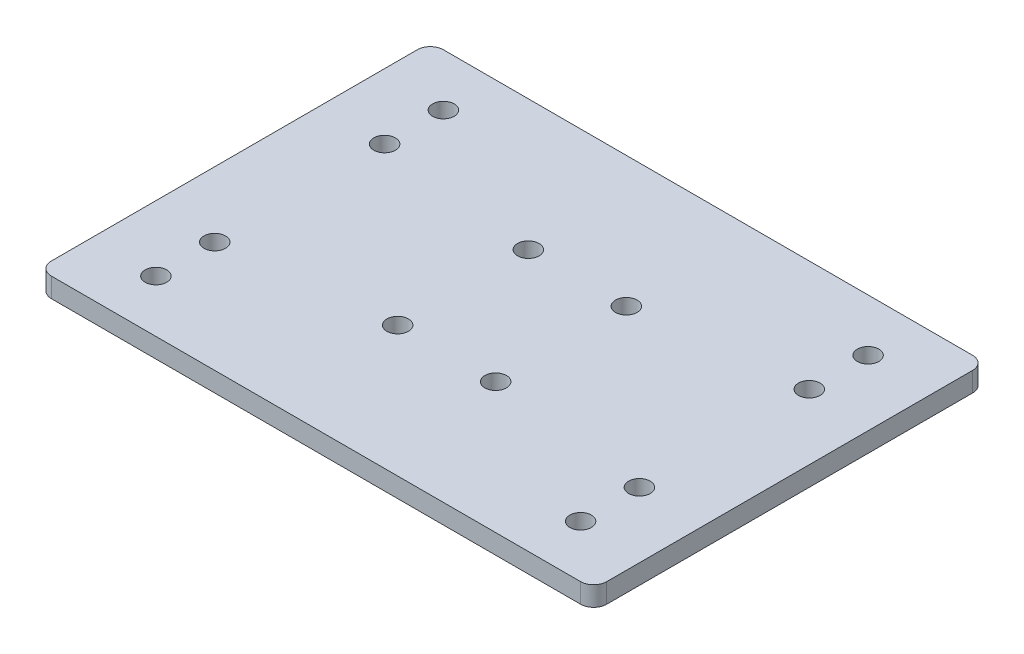
ISO-10303-21;
HEADER;
FILE_DESCRIPTION(('STEP AP214'),'2;1');
FILE_NAME('part.step','',(''),(''),'','','');
FILE_SCHEMA(('AUTOMOTIVE_DESIGN { 1 0 10303 214 1 1 1 1 }'));
ENDSEC;
DATA;
#1=APPLICATION_CONTEXT('core data for automotive mechanical design processes');
#2=APPLICATION_PROTOCOL_DEFINITION('international standard','automotive_design',2000,#1);
#3=PRODUCT_CONTEXT('',#1,'mechanical');
#4=PRODUCT('Part','Part','',(#3));
#5=PRODUCT_RELATED_PRODUCT_CATEGORY('part','',(#4));
#6=PRODUCT_DEFINITION_FORMATION('','',#4);
#7=PRODUCT_DEFINITION_CONTEXT('part definition',#1,'design');
#8=PRODUCT_DEFINITION('design','',#6,#7);
#9=PRODUCT_DEFINITION_SHAPE('','',#8);
#10=(LENGTH_UNIT() NAMED_UNIT(*) SI_UNIT(.MILLI.,.METRE.));
#11=(NAMED_UNIT(*) PLANE_ANGLE_UNIT() SI_UNIT($,.RADIAN.));
#12=(NAMED_UNIT(*) SI_UNIT($,.STERADIAN.) SOLID_ANGLE_UNIT());
#13=UNCERTAINTY_MEASURE_WITH_UNIT(LENGTH_MEASURE(1.E-05),#10,'distance_accuracy_value','');
#14=(GEOMETRIC_REPRESENTATION_CONTEXT(3) GLOBAL_UNCERTAINTY_ASSIGNED_CONTEXT((#13)) GLOBAL_UNIT_ASSIGNED_CONTEXT((#10,
#11,#12)) REPRESENTATION_CONTEXT('',''));
#15=CARTESIAN_POINT('',(0.,0.,0.));
#16=DIRECTION('',(0.,0.,1.));
#17=DIRECTION('',(1.,0.,0.));
#18=AXIS2_PLACEMENT_3D('',#15,#16,#17);
#19=CARTESIAN_POINT('',(42.5,3.,30.));
#20=DIRECTION('',(-1.,0.,0.));
#21=DIRECTION('',(0.,0.,1.));
#22=AXIS2_PLACEMENT_3D('',#19,#20,#21);
#23=PLANE('',#22);
#24=DIRECTION('',(0.,0.,-1.));
#25=VECTOR('',#24,1.);
#26=CARTESIAN_POINT('',(42.5,3.,30.));
#27=LINE('',#26,#25);
#28=CARTESIAN_POINT('',(42.5,3.,28.));
#29=VERTEX_POINT('',#28);
#30=CARTESIAN_POINT('',(42.5,3.,-28.));
#31=VERTEX_POINT('',#30);
#32=EDGE_CURVE('E129',#29,#31,#27,.T.);
#33=ORIENTED_EDGE('',*,*,#32,.F.);
#34=DIRECTION('',(0.,-1.,0.));
#35=VECTOR('',#34,1.);
#36=CARTESIAN_POINT('',(42.5,3.,28.));
#37=LINE('',#36,#35);
#38=CARTESIAN_POINT('',(42.5,0.,28.));
#39=VERTEX_POINT('',#38);
#40=EDGE_CURVE('E113',#29,#39,#37,.T.);
#41=ORIENTED_EDGE('',*,*,#40,.T.);
#42=DIRECTION('',(0.,0.,-1.));
#43=VECTOR('',#42,1.);
#44=CARTESIAN_POINT('',(42.5,0.,30.));
#45=LINE('',#44,#43);
#46=CARTESIAN_POINT('',(42.5,0.,-28.));
#47=VERTEX_POINT('',#46);
#48=EDGE_CURVE('E123',#39,#47,#45,.T.);
#49=ORIENTED_EDGE('',*,*,#48,.T.);
#50=DIRECTION('',(0.,-1.,0.));
#51=VECTOR('',#50,1.);
#52=CARTESIAN_POINT('',(42.5,3.,-28.));
#53=LINE('',#52,#51);
#54=EDGE_CURVE('E128',#47,#31,#53,.F.);
#55=ORIENTED_EDGE('',*,*,#54,.T.);
#56=EDGE_LOOP('',(#33,#41,#49,#55));
#57=FACE_BOUND('',#56,.T.);
#58=ADVANCED_FACE('F43',(#57),#23,.F.);
#59=CARTESIAN_POINT('',(-42.5,3.,-30.));
#60=DIRECTION('',(0.,0.,1.));
#61=DIRECTION('',(1.,0.,0.));
#62=AXIS2_PLACEMENT_3D('',#59,#60,#61);
#63=PLANE('',#62);
#64=DIRECTION('',(-1.,0.,0.));
#65=VECTOR('',#64,1.);
#66=CARTESIAN_POINT('',(-42.5,0.,-30.));
#67=LINE('',#66,#65);
#68=CARTESIAN_POINT('',(40.5,0.,-30.));
#69=VERTEX_POINT('',#68);
#70=CARTESIAN_POINT('',(-40.5,0.,-30.));
#71=VERTEX_POINT('',#70);
#72=EDGE_CURVE('E133',#69,#71,#67,.T.);
#73=ORIENTED_EDGE('',*,*,#72,.T.);
#74=DIRECTION('',(0.,-1.,0.));
#75=VECTOR('',#74,1.);
#76=CARTESIAN_POINT('',(-40.5,3.,-30.));
#77=LINE('',#76,#75);
#78=CARTESIAN_POINT('',(-40.5,3.,-30.));
#79=VERTEX_POINT('',#78);
#80=EDGE_CURVE('E11',#71,#79,#77,.F.);
#81=ORIENTED_EDGE('',*,*,#80,.T.);
#82=DIRECTION('',(-1.,0.,0.));
#83=VECTOR('',#82,1.);
#84=CARTESIAN_POINT('',(-42.5,3.,-30.));
#85=LINE('',#84,#83);
#86=CARTESIAN_POINT('',(40.5,3.,-30.));
#87=VERTEX_POINT('',#86);
#88=EDGE_CURVE('E205',#87,#79,#85,.T.);
#89=ORIENTED_EDGE('',*,*,#88,.F.);
#90=DIRECTION('',(0.,-1.,0.));
#91=VECTOR('',#90,1.);
#92=CARTESIAN_POINT('',(40.5,3.,-30.));
#93=LINE('',#92,#91);
#94=EDGE_CURVE('E51',#87,#69,#93,.T.);
#95=ORIENTED_EDGE('',*,*,#94,.T.);
#96=EDGE_LOOP('',(#73,#81,#89,#95));
#97=FACE_BOUND('',#96,.T.);
#98=ADVANCED_FACE('F197',(#97),#63,.F.);
#99=CARTESIAN_POINT('',(-42.5,3.,30.));
#100=DIRECTION('',(1.,0.,0.));
#101=DIRECTION('',(0.,0.,-1.));
#102=AXIS2_PLACEMENT_3D('',#99,#100,#101);
#103=PLANE('',#102);
#104=DIRECTION('',(0.,0.,1.));
#105=VECTOR('',#104,1.);
#106=CARTESIAN_POINT('',(-42.5,0.,30.));
#107=LINE('',#106,#105);
#108=CARTESIAN_POINT('',(-42.5,0.,-28.));
#109=VERTEX_POINT('',#108);
#110=CARTESIAN_POINT('',(-42.5,0.,28.));
#111=VERTEX_POINT('',#110);
#112=EDGE_CURVE('E137',#109,#111,#107,.T.);
#113=ORIENTED_EDGE('',*,*,#112,.T.);
#114=DIRECTION('',(0.,-1.,0.));
#115=VECTOR('',#114,1.);
#116=CARTESIAN_POINT('',(-42.5,3.,28.));
#117=LINE('',#116,#115);
#118=CARTESIAN_POINT('',(-42.5,3.,28.));
#119=VERTEX_POINT('',#118);
#120=EDGE_CURVE('E59',#111,#119,#117,.F.);
#121=ORIENTED_EDGE('',*,*,#120,.T.);
#122=DIRECTION('',(0.,0.,1.));
#123=VECTOR('',#122,1.);
#124=CARTESIAN_POINT('',(-42.5,3.,30.));
#125=LINE('',#124,#123);
#126=CARTESIAN_POINT('',(-42.5,3.,-28.));
#127=VERTEX_POINT('',#126);
#128=EDGE_CURVE('E208',#127,#119,#125,.T.);
#129=ORIENTED_EDGE('',*,*,#128,.F.);
#130=DIRECTION('',(0.,-1.,0.));
#131=VECTOR('',#130,1.);
#132=CARTESIAN_POINT('',(-42.5,3.,-28.));
#133=LINE('',#132,#131);
#134=EDGE_CURVE('E194',#127,#109,#133,.T.);
#135=ORIENTED_EDGE('',*,*,#134,.T.);
#136=EDGE_LOOP('',(#113,#121,#129,#135));
#137=FACE_BOUND('',#136,.T.);
#138=ADVANCED_FACE('F209',(#137),#103,.F.);
#139=CARTESIAN_POINT('',(-42.5,3.,30.));
#140=DIRECTION('',(0.,0.,-1.));
#141=DIRECTION('',(-1.,0.,0.));
#142=AXIS2_PLACEMENT_3D('',#139,#140,#141);
#143=PLANE('',#142);
#144=DIRECTION('',(1.,0.,0.));
#145=VECTOR('',#144,1.);
#146=CARTESIAN_POINT('',(-42.5,0.,30.));
#147=LINE('',#146,#145);
#148=CARTESIAN_POINT('',(-40.5,0.,30.));
#149=VERTEX_POINT('',#148);
#150=CARTESIAN_POINT('',(40.5,0.,30.));
#151=VERTEX_POINT('',#150);
#152=EDGE_CURVE('E149',#149,#151,#147,.T.);
#153=ORIENTED_EDGE('',*,*,#152,.T.);
#154=DIRECTION('',(0.,-1.,0.));
#155=VECTOR('',#154,1.);
#156=CARTESIAN_POINT('',(40.5,3.,30.));
#157=LINE('',#156,#155);
#158=CARTESIAN_POINT('',(40.5,3.,30.));
#159=VERTEX_POINT('',#158);
#160=EDGE_CURVE('E112',#151,#159,#157,.F.);
#161=ORIENTED_EDGE('',*,*,#160,.T.);
#162=DIRECTION('',(1.,0.,0.));
#163=VECTOR('',#162,1.);
#164=CARTESIAN_POINT('',(-42.5,3.,30.));
#165=LINE('',#164,#163);
#166=CARTESIAN_POINT('',(-40.5,3.,30.));
#167=VERTEX_POINT('',#166);
#168=EDGE_CURVE('E144',#167,#159,#165,.T.);
#169=ORIENTED_EDGE('',*,*,#168,.F.);
#170=DIRECTION('',(0.,-1.,0.));
#171=VECTOR('',#170,1.);
#172=CARTESIAN_POINT('',(-40.5,3.,30.));
#173=LINE('',#172,#171);
#174=EDGE_CURVE('E118',#167,#149,#173,.T.);
#175=ORIENTED_EDGE('',*,*,#174,.T.);
#176=EDGE_LOOP('',(#153,#161,#169,#175));
#177=FACE_BOUND('',#176,.T.);
#178=ADVANCED_FACE('F297',(#177),#143,.F.);
#179=CARTESIAN_POINT('',(0.,3.,0.));
#180=DIRECTION('',(0.,-1.,0.));
#181=DIRECTION('',(0.,0.,-1.));
#182=AXIS2_PLACEMENT_3D('',#179,#180,#181);
#183=PLANE('',#182);
#184=CARTESIAN_POINT('',(-32.5,3.,22.));
#185=DIRECTION('',(0.,-1.,0.));
#186=DIRECTION('',(0.,0.,-1.));
#187=AXIS2_PLACEMENT_3D('',#184,#185,#186);
#188=CIRCLE('',#187,1.65);
#189=CARTESIAN_POINT('',(-32.5,3.,20.35));
#190=VERTEX_POINT('',#189);
#191=EDGE_CURVE('E247',#190,#190,#188,.T.);
#192=ORIENTED_EDGE('',*,*,#191,.T.);
#193=EDGE_LOOP('',(#192));
#194=FACE_BOUND('',#193,.T.);
#195=CARTESIAN_POINT('',(-32.5,3.,13.));
#196=DIRECTION('',(0.,-1.,0.));
#197=DIRECTION('',(0.,0.,-1.));
#198=AXIS2_PLACEMENT_3D('',#195,#196,#197);
#199=CIRCLE('',#198,1.65);
#200=CARTESIAN_POINT('',(-32.5,3.,11.35));
#201=VERTEX_POINT('',#200);
#202=EDGE_CURVE('E252',#201,#201,#199,.T.);
#203=ORIENTED_EDGE('',*,*,#202,.T.);
#204=EDGE_LOOP('',(#203));
#205=FACE_BOUND('',#204,.T.);
#206=CARTESIAN_POINT('',(-32.5,3.,-22.));
#207=DIRECTION('',(0.,-1.,0.));
#208=DIRECTION('',(0.,0.,1.));
#209=AXIS2_PLACEMENT_3D('',#206,#207,#208);
#210=CIRCLE('',#209,1.65);
#211=CARTESIAN_POINT('',(-32.5,3.,-20.35));
#212=VERTEX_POINT('',#211);
#213=EDGE_CURVE('E250',#212,#212,#210,.T.);
#214=ORIENTED_EDGE('',*,*,#213,.T.);
#215=EDGE_LOOP('',(#214));
#216=FACE_BOUND('',#215,.T.);
#217=CARTESIAN_POINT('',(-32.5,3.,-13.));
#218=DIRECTION('',(0.,-1.,0.));
#219=DIRECTION('',(0.,0.,1.));
#220=AXIS2_PLACEMENT_3D('',#217,#218,#219);
#221=CIRCLE('',#220,1.65);
#222=CARTESIAN_POINT('',(-32.5,3.,-11.35));
#223=VERTEX_POINT('',#222);
#224=EDGE_CURVE('E166',#223,#223,#221,.T.);
#225=ORIENTED_EDGE('',*,*,#224,.T.);
#226=EDGE_LOOP('',(#225));
#227=FACE_BOUND('',#226,.T.);
#228=CARTESIAN_POINT('',(32.5,3.,22.));
#229=DIRECTION('',(0.,1.,0.));
#230=DIRECTION('',(0.,0.,-1.));
#231=AXIS2_PLACEMENT_3D('',#228,#229,#230);
#232=CIRCLE('',#231,1.65);
#233=CARTESIAN_POINT('',(32.5,3.,20.35));
#234=VERTEX_POINT('',#233);
#235=EDGE_CURVE('E180',#234,#234,#232,.T.);
#236=ORIENTED_EDGE('',*,*,#235,.F.);
#237=EDGE_LOOP('',(#236));
#238=FACE_BOUND('',#237,.T.);
#239=CARTESIAN_POINT('',(32.5,3.,13.));
#240=DIRECTION('',(0.,1.,0.));
#241=DIRECTION('',(0.,0.,-1.));
#242=AXIS2_PLACEMENT_3D('',#239,#240,#241);
#243=CIRCLE('',#242,1.65);
#244=CARTESIAN_POINT('',(32.5,3.,11.35));
#245=VERTEX_POINT('',#244);
#246=EDGE_CURVE('E239',#245,#245,#243,.T.);
#247=ORIENTED_EDGE('',*,*,#246,.F.);
#248=EDGE_LOOP('',(#247));
#249=FACE_BOUND('',#248,.T.);
#250=CARTESIAN_POINT('',(32.5,3.,-22.));
#251=DIRECTION('',(0.,1.,0.));
#252=DIRECTION('',(0.,0.,1.));
#253=AXIS2_PLACEMENT_3D('',#250,#251,#252);
#254=CIRCLE('',#253,1.65);
#255=CARTESIAN_POINT('',(32.5,3.,-20.35));
#256=VERTEX_POINT('',#255);
#257=EDGE_CURVE('E240',#256,#256,#254,.T.);
#258=ORIENTED_EDGE('',*,*,#257,.F.);
#259=EDGE_LOOP('',(#258));
#260=FACE_BOUND('',#259,.T.);
#261=CARTESIAN_POINT('',(32.5,3.,-13.));
#262=DIRECTION('',(0.,1.,0.));
#263=DIRECTION('',(0.,0.,1.));
#264=AXIS2_PLACEMENT_3D('',#261,#262,#263);
#265=CIRCLE('',#264,1.65);
#266=CARTESIAN_POINT('',(32.5,3.,-11.35));
#267=VERTEX_POINT('',#266);
#268=EDGE_CURVE('E153',#267,#267,#265,.T.);
#269=ORIENTED_EDGE('',*,*,#268,.F.);
#270=EDGE_LOOP('',(#269));
#271=FACE_BOUND('',#270,.T.);
#272=CARTESIAN_POINT('',(7.5,3.,10.));
#273=DIRECTION('',(0.,1.,0.));
#274=DIRECTION('',(0.,0.,1.));
#275=AXIS2_PLACEMENT_3D('',#272,#273,#274);
#276=CIRCLE('',#275,1.65);
#277=CARTESIAN_POINT('',(7.5,3.,11.65));
#278=VERTEX_POINT('',#277);
#279=EDGE_CURVE('E221',#278,#278,#276,.T.);
#280=ORIENTED_EDGE('',*,*,#279,.F.);
#281=EDGE_LOOP('',(#280));
#282=FACE_BOUND('',#281,.T.);
#283=CARTESIAN_POINT('',(-7.5,3.,10.));
#284=DIRECTION('',(0.,1.,0.));
#285=DIRECTION('',(0.,0.,1.));
#286=AXIS2_PLACEMENT_3D('',#283,#284,#285);
#287=CIRCLE('',#286,1.65);
#288=CARTESIAN_POINT('',(-7.5,3.,11.65));
#289=VERTEX_POINT('',#288);
#290=EDGE_CURVE('E227',#289,#289,#287,.T.);
#291=ORIENTED_EDGE('',*,*,#290,.F.);
#292=EDGE_LOOP('',(#291));
#293=FACE_BOUND('',#292,.T.);
#294=CARTESIAN_POINT('',(-7.5,3.,-10.));
#295=DIRECTION('',(0.,1.,0.));
#296=DIRECTION('',(0.,0.,1.));
#297=AXIS2_PLACEMENT_3D('',#294,#295,#296);
#298=CIRCLE('',#297,1.65);
#299=CARTESIAN_POINT('',(-7.5,3.,-8.35));
#300=VERTEX_POINT('',#299);
#301=EDGE_CURVE('E216',#300,#300,#298,.T.);
#302=ORIENTED_EDGE('',*,*,#301,.F.);
#303=EDGE_LOOP('',(#302));
#304=FACE_BOUND('',#303,.T.);
#305=CARTESIAN_POINT('',(7.5,3.,-10.));
#306=DIRECTION('',(0.,1.,0.));
#307=DIRECTION('',(0.,0.,1.));
#308=AXIS2_PLACEMENT_3D('',#305,#306,#307);
#309=CIRCLE('',#308,1.65);
#310=CARTESIAN_POINT('',(7.5,3.,-8.35));
#311=VERTEX_POINT('',#310);
#312=EDGE_CURVE('E142',#311,#311,#309,.T.);
#313=ORIENTED_EDGE('',*,*,#312,.F.);
#314=EDGE_LOOP('',(#313));
#315=FACE_BOUND('',#314,.T.);
#316=ORIENTED_EDGE('',*,*,#168,.T.);
#317=CARTESIAN_POINT('',(40.5,3.,28.));
#318=DIRECTION('',(0.,-1.,0.));
#319=DIRECTION('',(0.,0.,-1.));
#320=AXIS2_PLACEMENT_3D('',#317,#318,#319);
#321=CIRCLE('',#320,2.);
#322=EDGE_CURVE('E192',#159,#29,#321,.F.);
#323=ORIENTED_EDGE('',*,*,#322,.T.);
#324=ORIENTED_EDGE('',*,*,#32,.T.);
#325=CARTESIAN_POINT('',(40.5,3.,-28.));
#326=DIRECTION('',(0.,-1.,0.));
#327=DIRECTION('',(0.,0.,-1.));
#328=AXIS2_PLACEMENT_3D('',#325,#326,#327);
#329=CIRCLE('',#328,2.);
#330=EDGE_CURVE('E187',#31,#87,#329,.F.);
#331=ORIENTED_EDGE('',*,*,#330,.T.);
#332=ORIENTED_EDGE('',*,*,#88,.T.);
#333=CARTESIAN_POINT('',(-40.5,3.,-28.));
#334=DIRECTION('',(0.,-1.,0.));
#335=DIRECTION('',(0.,0.,-1.));
#336=AXIS2_PLACEMENT_3D('',#333,#334,#335);
#337=CIRCLE('',#336,2.);
#338=EDGE_CURVE('E63',#79,#127,#337,.F.);
#339=ORIENTED_EDGE('',*,*,#338,.T.);
#340=ORIENTED_EDGE('',*,*,#128,.T.);
#341=CARTESIAN_POINT('',(-40.5,3.,28.));
#342=DIRECTION('',(0.,-1.,0.));
#343=DIRECTION('',(0.,0.,-1.));
#344=AXIS2_PLACEMENT_3D('',#341,#342,#343);
#345=CIRCLE('',#344,2.);
#346=EDGE_CURVE('E186',#119,#167,#345,.F.);
#347=ORIENTED_EDGE('',*,*,#346,.T.);
#348=EDGE_LOOP('',(#316,#323,#324,#331,#332,#339,#340,#347));
#349=FACE_BOUND('',#348,.T.);
#350=ADVANCED_FACE('F260',(#194,#205,#216,#227,#238,#249,#260,#271,#282,#293,#304,#315,#349),
#183,.F.);
#351=CARTESIAN_POINT('',(0.,0.,0.));
#352=DIRECTION('',(0.,-1.,0.));
#353=DIRECTION('',(0.,0.,-1.));
#354=AXIS2_PLACEMENT_3D('',#351,#352,#353);
#355=PLANE('',#354);
#356=CARTESIAN_POINT('',(-32.5,0.,22.));
#357=DIRECTION('',(0.,-1.,0.));
#358=DIRECTION('',(0.,0.,-1.));
#359=AXIS2_PLACEMENT_3D('',#356,#357,#358);
#360=CIRCLE('',#359,1.65);
#361=CARTESIAN_POINT('',(-32.5,0.,20.35));
#362=VERTEX_POINT('',#361);
#363=EDGE_CURVE('E172',#362,#362,#360,.F.);
#364=ORIENTED_EDGE('',*,*,#363,.T.);
#365=EDGE_LOOP('',(#364));
#366=FACE_BOUND('',#365,.T.);
#367=CARTESIAN_POINT('',(-32.5,0.,13.));
#368=DIRECTION('',(0.,-1.,0.));
#369=DIRECTION('',(0.,0.,-1.));
#370=AXIS2_PLACEMENT_3D('',#367,#368,#369);
#371=CIRCLE('',#370,1.65);
#372=CARTESIAN_POINT('',(-32.5,0.,11.35));
#373=VERTEX_POINT('',#372);
#374=EDGE_CURVE('E171',#373,#373,#371,.F.);
#375=ORIENTED_EDGE('',*,*,#374,.T.);
#376=EDGE_LOOP('',(#375));
#377=FACE_BOUND('',#376,.T.);
#378=CARTESIAN_POINT('',(-32.5,0.,-22.));
#379=DIRECTION('',(0.,-1.,0.));
#380=DIRECTION('',(0.,0.,-1.));
#381=AXIS2_PLACEMENT_3D('',#378,#379,#380);
#382=CIRCLE('',#381,1.65);
#383=CARTESIAN_POINT('',(-32.5,0.,-23.65));
#384=VERTEX_POINT('',#383);
#385=EDGE_CURVE('E170',#384,#384,#382,.F.);
#386=ORIENTED_EDGE('',*,*,#385,.T.);
#387=EDGE_LOOP('',(#386));
#388=FACE_BOUND('',#387,.T.);
#389=CARTESIAN_POINT('',(-32.5,0.,-13.));
#390=DIRECTION('',(0.,-1.,0.));
#391=DIRECTION('',(0.,0.,-1.));
#392=AXIS2_PLACEMENT_3D('',#389,#390,#391);
#393=CIRCLE('',#392,1.65);
#394=CARTESIAN_POINT('',(-32.5,0.,-14.65));
#395=VERTEX_POINT('',#394);
#396=EDGE_CURVE('E165',#395,#395,#393,.F.);
#397=ORIENTED_EDGE('',*,*,#396,.T.);
#398=EDGE_LOOP('',(#397));
#399=FACE_BOUND('',#398,.T.);
#400=CARTESIAN_POINT('',(32.5,0.,22.));
#401=DIRECTION('',(0.,-1.,0.));
#402=DIRECTION('',(0.,0.,-1.));
#403=AXIS2_PLACEMENT_3D('',#400,#401,#402);
#404=CIRCLE('',#403,1.65);
#405=CARTESIAN_POINT('',(32.5,0.,20.35));
#406=VERTEX_POINT('',#405);
#407=EDGE_CURVE('E159',#406,#406,#404,.T.);
#408=ORIENTED_EDGE('',*,*,#407,.F.);
#409=EDGE_LOOP('',(#408));
#410=FACE_BOUND('',#409,.T.);
#411=CARTESIAN_POINT('',(32.5,0.,13.));
#412=DIRECTION('',(0.,-1.,0.));
#413=DIRECTION('',(0.,0.,-1.));
#414=AXIS2_PLACEMENT_3D('',#411,#412,#413);
#415=CIRCLE('',#414,1.65);
#416=CARTESIAN_POINT('',(32.5,0.,11.35));
#417=VERTEX_POINT('',#416);
#418=EDGE_CURVE('E160',#417,#417,#415,.T.);
#419=ORIENTED_EDGE('',*,*,#418,.F.);
#420=EDGE_LOOP('',(#419));
#421=FACE_BOUND('',#420,.T.);
#422=CARTESIAN_POINT('',(32.5,0.,-22.));
#423=DIRECTION('',(0.,-1.,0.));
#424=DIRECTION('',(0.,0.,-1.));
#425=AXIS2_PLACEMENT_3D('',#422,#423,#424);
#426=CIRCLE('',#425,1.65);
#427=CARTESIAN_POINT('',(32.5,0.,-23.65));
#428=VERTEX_POINT('',#427);
#429=EDGE_CURVE('E155',#428,#428,#426,.T.);
#430=ORIENTED_EDGE('',*,*,#429,.F.);
#431=EDGE_LOOP('',(#430));
#432=FACE_BOUND('',#431,.T.);
#433=CARTESIAN_POINT('',(32.5,0.,-13.));
#434=DIRECTION('',(0.,-1.,0.));
#435=DIRECTION('',(0.,0.,-1.));
#436=AXIS2_PLACEMENT_3D('',#433,#434,#435);
#437=CIRCLE('',#436,1.65);
#438=CARTESIAN_POINT('',(32.5,0.,-14.65));
#439=VERTEX_POINT('',#438);
#440=EDGE_CURVE('E148',#439,#439,#437,.T.);
#441=ORIENTED_EDGE('',*,*,#440,.F.);
#442=EDGE_LOOP('',(#441));
#443=FACE_BOUND('',#442,.T.);
#444=CARTESIAN_POINT('',(7.5,0.,10.));
#445=DIRECTION('',(0.,1.,0.));
#446=DIRECTION('',(0.,0.,1.));
#447=AXIS2_PLACEMENT_3D('',#444,#445,#446);
#448=CIRCLE('',#447,1.65);
#449=CARTESIAN_POINT('',(7.5,0.,11.65));
#450=VERTEX_POINT('',#449);
#451=EDGE_CURVE('E161',#450,#450,#448,.T.);
#452=ORIENTED_EDGE('',*,*,#451,.T.);
#453=EDGE_LOOP('',(#452));
#454=FACE_BOUND('',#453,.T.);
#455=CARTESIAN_POINT('',(-7.5,0.,10.));
#456=DIRECTION('',(0.,1.,0.));
#457=DIRECTION('',(0.,0.,1.));
#458=AXIS2_PLACEMENT_3D('',#455,#456,#457);
#459=CIRCLE('',#458,1.65);
#460=CARTESIAN_POINT('',(-7.5,0.,11.65));
#461=VERTEX_POINT('',#460);
#462=EDGE_CURVE('E223',#461,#461,#459,.T.);
#463=ORIENTED_EDGE('',*,*,#462,.T.);
#464=EDGE_LOOP('',(#463));
#465=FACE_BOUND('',#464,.T.);
#466=CARTESIAN_POINT('',(-7.5,0.,-10.));
#467=DIRECTION('',(0.,1.,0.));
#468=DIRECTION('',(0.,0.,1.));
#469=AXIS2_PLACEMENT_3D('',#466,#467,#468);
#470=CIRCLE('',#469,1.65);
#471=CARTESIAN_POINT('',(-7.5,0.,-8.35));
#472=VERTEX_POINT('',#471);
#473=EDGE_CURVE('E229',#472,#472,#470,.T.);
#474=ORIENTED_EDGE('',*,*,#473,.T.);
#475=EDGE_LOOP('',(#474));
#476=FACE_BOUND('',#475,.T.);
#477=CARTESIAN_POINT('',(7.5,0.,-10.));
#478=DIRECTION('',(0.,1.,0.));
#479=DIRECTION('',(0.,0.,1.));
#480=AXIS2_PLACEMENT_3D('',#477,#478,#479);
#481=CIRCLE('',#480,1.65);
#482=CARTESIAN_POINT('',(7.5,0.,-8.35));
#483=VERTEX_POINT('',#482);
#484=EDGE_CURVE('E132',#483,#483,#481,.T.);
#485=ORIENTED_EDGE('',*,*,#484,.T.);
#486=EDGE_LOOP('',(#485));
#487=FACE_BOUND('',#486,.T.);
#488=ORIENTED_EDGE('',*,*,#48,.F.);
#489=CARTESIAN_POINT('',(40.5,0.,28.));
#490=DIRECTION('',(0.,-1.,0.));
#491=DIRECTION('',(0.,0.,-1.));
#492=AXIS2_PLACEMENT_3D('',#489,#490,#491);
#493=CIRCLE('',#492,2.);
#494=EDGE_CURVE('E107',#39,#151,#493,.T.);
#495=ORIENTED_EDGE('',*,*,#494,.T.);
#496=ORIENTED_EDGE('',*,*,#152,.F.);
#497=CARTESIAN_POINT('',(-40.5,0.,28.));
#498=DIRECTION('',(0.,-1.,0.));
#499=DIRECTION('',(0.,0.,-1.));
#500=AXIS2_PLACEMENT_3D('',#497,#498,#499);
#501=CIRCLE('',#500,2.);
#502=EDGE_CURVE('E119',#149,#111,#501,.T.);
#503=ORIENTED_EDGE('',*,*,#502,.T.);
#504=ORIENTED_EDGE('',*,*,#112,.F.);
#505=CARTESIAN_POINT('',(-40.5,0.,-28.));
#506=DIRECTION('',(0.,-1.,0.));
#507=DIRECTION('',(0.,0.,-1.));
#508=AXIS2_PLACEMENT_3D('',#505,#506,#507);
#509=CIRCLE('',#508,2.);
#510=EDGE_CURVE('E179',#109,#71,#509,.T.);
#511=ORIENTED_EDGE('',*,*,#510,.T.);
#512=ORIENTED_EDGE('',*,*,#72,.F.);
#513=CARTESIAN_POINT('',(40.5,0.,-28.));
#514=DIRECTION('',(0.,-1.,0.));
#515=DIRECTION('',(0.,0.,-1.));
#516=AXIS2_PLACEMENT_3D('',#513,#514,#515);
#517=CIRCLE('',#516,2.);
#518=EDGE_CURVE('E126',#69,#47,#517,.T.);
#519=ORIENTED_EDGE('',*,*,#518,.T.);
#520=EDGE_LOOP('',(#488,#495,#496,#503,#504,#511,#512,#519));
#521=FACE_BOUND('',#520,.T.);
#522=ADVANCED_FACE('F131',(#366,#377,#388,#399,#410,#421,#432,#443,#454,#465,#476,#487,#521),
#355,.T.);
#523=CARTESIAN_POINT('',(7.5,0.,-10.));
#524=DIRECTION('',(0.,1.,0.));
#525=DIRECTION('',(0.,0.,1.));
#526=AXIS2_PLACEMENT_3D('',#523,#524,#525);
#527=CYLINDRICAL_SURFACE('',#526,1.65);
#528=ORIENTED_EDGE('',*,*,#484,.F.);
#529=EDGE_LOOP('',(#528));
#530=FACE_BOUND('',#529,.T.);
#531=ORIENTED_EDGE('',*,*,#312,.T.);
#532=EDGE_LOOP('',(#531));
#533=FACE_BOUND('',#532,.T.);
#534=ADVANCED_FACE('F311',(#530,#533),#527,.F.);
#535=CARTESIAN_POINT('',(-7.5,0.,-10.));
#536=DIRECTION('',(0.,1.,0.));
#537=DIRECTION('',(0.,0.,1.));
#538=AXIS2_PLACEMENT_3D('',#535,#536,#537);
#539=CYLINDRICAL_SURFACE('',#538,1.65);
#540=ORIENTED_EDGE('',*,*,#473,.F.);
#541=EDGE_LOOP('',(#540));
#542=FACE_BOUND('',#541,.T.);
#543=ORIENTED_EDGE('',*,*,#301,.T.);
#544=EDGE_LOOP('',(#543));
#545=FACE_BOUND('',#544,.T.);
#546=ADVANCED_FACE('F317',(#542,#545),#539,.F.);
#547=CARTESIAN_POINT('',(-7.5,0.,10.));
#548=DIRECTION('',(0.,1.,0.));
#549=DIRECTION('',(0.,0.,1.));
#550=AXIS2_PLACEMENT_3D('',#547,#548,#549);
#551=CYLINDRICAL_SURFACE('',#550,1.65);
#552=ORIENTED_EDGE('',*,*,#462,.F.);
#553=EDGE_LOOP('',(#552));
#554=FACE_BOUND('',#553,.T.);
#555=ORIENTED_EDGE('',*,*,#290,.T.);
#556=EDGE_LOOP('',(#555));
#557=FACE_BOUND('',#556,.T.);
#558=ADVANCED_FACE('F325',(#554,#557),#551,.F.);
#559=CARTESIAN_POINT('',(7.5,0.,10.));
#560=DIRECTION('',(0.,1.,0.));
#561=DIRECTION('',(0.,0.,1.));
#562=AXIS2_PLACEMENT_3D('',#559,#560,#561);
#563=CYLINDRICAL_SURFACE('',#562,1.65);
#564=ORIENTED_EDGE('',*,*,#451,.F.);
#565=EDGE_LOOP('',(#564));
#566=FACE_BOUND('',#565,.T.);
#567=ORIENTED_EDGE('',*,*,#279,.T.);
#568=EDGE_LOOP('',(#567));
#569=FACE_BOUND('',#568,.T.);
#570=ADVANCED_FACE('F319',(#566,#569),#563,.F.);
#571=CARTESIAN_POINT('',(32.5,-97.,-13.));
#572=DIRECTION('',(0.,1.,0.));
#573=DIRECTION('',(0.,0.,1.));
#574=AXIS2_PLACEMENT_3D('',#571,#572,#573);
#575=CYLINDRICAL_SURFACE('',#574,1.65);
#576=ORIENTED_EDGE('',*,*,#440,.T.);
#577=EDGE_LOOP('',(#576));
#578=FACE_BOUND('',#577,.T.);
#579=ORIENTED_EDGE('',*,*,#268,.T.);
#580=EDGE_LOOP('',(#579));
#581=FACE_BOUND('',#580,.T.);
#582=ADVANCED_FACE('F322',(#578,#581),#575,.F.);
#583=CARTESIAN_POINT('',(32.5,-97.,-22.));
#584=DIRECTION('',(0.,1.,0.));
#585=DIRECTION('',(0.,0.,1.));
#586=AXIS2_PLACEMENT_3D('',#583,#584,#585);
#587=CYLINDRICAL_SURFACE('',#586,1.65);
#588=ORIENTED_EDGE('',*,*,#429,.T.);
#589=EDGE_LOOP('',(#588));
#590=FACE_BOUND('',#589,.T.);
#591=ORIENTED_EDGE('',*,*,#257,.T.);
#592=EDGE_LOOP('',(#591));
#593=FACE_BOUND('',#592,.T.);
#594=ADVANCED_FACE('F335',(#590,#593),#587,.F.);
#595=CARTESIAN_POINT('',(32.5,-97.,13.));
#596=DIRECTION('',(0.,1.,0.));
#597=DIRECTION('',(0.,0.,1.));
#598=AXIS2_PLACEMENT_3D('',#595,#596,#597);
#599=CYLINDRICAL_SURFACE('',#598,1.65);
#600=ORIENTED_EDGE('',*,*,#418,.T.);
#601=EDGE_LOOP('',(#600));
#602=FACE_BOUND('',#601,.T.);
#603=ORIENTED_EDGE('',*,*,#246,.T.);
#604=EDGE_LOOP('',(#603));
#605=FACE_BOUND('',#604,.T.);
#606=ADVANCED_FACE('F337',(#602,#605),#599,.F.);
#607=CARTESIAN_POINT('',(32.5,-97.,22.));
#608=DIRECTION('',(0.,1.,0.));
#609=DIRECTION('',(0.,0.,1.));
#610=AXIS2_PLACEMENT_3D('',#607,#608,#609);
#611=CYLINDRICAL_SURFACE('',#610,1.65);
#612=ORIENTED_EDGE('',*,*,#407,.T.);
#613=EDGE_LOOP('',(#612));
#614=FACE_BOUND('',#613,.T.);
#615=ORIENTED_EDGE('',*,*,#235,.T.);
#616=EDGE_LOOP('',(#615));
#617=FACE_BOUND('',#616,.T.);
#618=ADVANCED_FACE('F271',(#614,#617),#611,.F.);
#619=CARTESIAN_POINT('',(-32.5,-97.,-13.));
#620=DIRECTION('',(0.,1.,0.));
#621=DIRECTION('',(0.,0.,1.));
#622=AXIS2_PLACEMENT_3D('',#619,#620,#621);
#623=CYLINDRICAL_SURFACE('',#622,1.65);
#624=ORIENTED_EDGE('',*,*,#396,.F.);
#625=EDGE_LOOP('',(#624));
#626=FACE_BOUND('',#625,.T.);
#627=ORIENTED_EDGE('',*,*,#224,.F.);
#628=EDGE_LOOP('',(#627));
#629=FACE_BOUND('',#628,.T.);
#630=ADVANCED_FACE('F265',(#626,#629),#623,.F.);
#631=CARTESIAN_POINT('',(-32.5,-97.,-22.));
#632=DIRECTION('',(0.,1.,0.));
#633=DIRECTION('',(0.,0.,1.));
#634=AXIS2_PLACEMENT_3D('',#631,#632,#633);
#635=CYLINDRICAL_SURFACE('',#634,1.65);
#636=ORIENTED_EDGE('',*,*,#385,.F.);
#637=EDGE_LOOP('',(#636));
#638=FACE_BOUND('',#637,.T.);
#639=ORIENTED_EDGE('',*,*,#213,.F.);
#640=EDGE_LOOP('',(#639));
#641=FACE_BOUND('',#640,.T.);
#642=ADVANCED_FACE('F258',(#638,#641),#635,.F.);
#643=CARTESIAN_POINT('',(-32.5,-97.,13.));
#644=DIRECTION('',(0.,1.,0.));
#645=DIRECTION('',(0.,0.,1.));
#646=AXIS2_PLACEMENT_3D('',#643,#644,#645);
#647=CYLINDRICAL_SURFACE('',#646,1.65);
#648=ORIENTED_EDGE('',*,*,#374,.F.);
#649=EDGE_LOOP('',(#648));
#650=FACE_BOUND('',#649,.T.);
#651=ORIENTED_EDGE('',*,*,#202,.F.);
#652=EDGE_LOOP('',(#651));
#653=FACE_BOUND('',#652,.T.);
#654=ADVANCED_FACE('F261',(#650,#653),#647,.F.);
#655=CARTESIAN_POINT('',(-32.5,-97.,22.));
#656=DIRECTION('',(0.,1.,0.));
#657=DIRECTION('',(0.,0.,1.));
#658=AXIS2_PLACEMENT_3D('',#655,#656,#657);
#659=CYLINDRICAL_SURFACE('',#658,1.65);
#660=ORIENTED_EDGE('',*,*,#363,.F.);
#661=EDGE_LOOP('',(#660));
#662=FACE_BOUND('',#661,.T.);
#663=ORIENTED_EDGE('',*,*,#191,.F.);
#664=EDGE_LOOP('',(#663));
#665=FACE_BOUND('',#664,.T.);
#666=ADVANCED_FACE('F269',(#662,#665),#659,.F.);
#667=CARTESIAN_POINT('',(40.5,3.,28.));
#668=DIRECTION('',(0.,-1.,0.));
#669=DIRECTION('',(0.,0.,-1.));
#670=AXIS2_PLACEMENT_3D('',#667,#668,#669);
#671=CYLINDRICAL_SURFACE('',#670,2.);
#672=ORIENTED_EDGE('',*,*,#322,.F.);
#673=ORIENTED_EDGE('',*,*,#160,.F.);
#674=ORIENTED_EDGE('',*,*,#494,.F.);
#675=ORIENTED_EDGE('',*,*,#40,.F.);
#676=EDGE_LOOP('',(#672,#673,#674,#675));
#677=FACE_BOUND('',#676,.T.);
#678=ADVANCED_FACE('F115',(#677),#671,.T.);
#679=CARTESIAN_POINT('',(-40.5,3.,28.));
#680=DIRECTION('',(0.,-1.,0.));
#681=DIRECTION('',(0.,0.,-1.));
#682=AXIS2_PLACEMENT_3D('',#679,#680,#681);
#683=CYLINDRICAL_SURFACE('',#682,2.);
#684=ORIENTED_EDGE('',*,*,#346,.F.);
#685=ORIENTED_EDGE('',*,*,#120,.F.);
#686=ORIENTED_EDGE('',*,*,#502,.F.);
#687=ORIENTED_EDGE('',*,*,#174,.F.);
#688=EDGE_LOOP('',(#684,#685,#686,#687));
#689=FACE_BOUND('',#688,.T.);
#690=ADVANCED_FACE('F287',(#689),#683,.T.);
#691=CARTESIAN_POINT('',(-40.5,3.,-28.));
#692=DIRECTION('',(0.,-1.,0.));
#693=DIRECTION('',(0.,0.,-1.));
#694=AXIS2_PLACEMENT_3D('',#691,#692,#693);
#695=CYLINDRICAL_SURFACE('',#694,2.);
#696=ORIENTED_EDGE('',*,*,#338,.F.);
#697=ORIENTED_EDGE('',*,*,#80,.F.);
#698=ORIENTED_EDGE('',*,*,#510,.F.);
#699=ORIENTED_EDGE('',*,*,#134,.F.);
#700=EDGE_LOOP('',(#696,#697,#698,#699));
#701=FACE_BOUND('',#700,.T.);
#702=ADVANCED_FACE('F206',(#701),#695,.T.);
#703=CARTESIAN_POINT('',(40.5,3.,-28.));
#704=DIRECTION('',(0.,-1.,0.));
#705=DIRECTION('',(0.,0.,-1.));
#706=AXIS2_PLACEMENT_3D('',#703,#704,#705);
#707=CYLINDRICAL_SURFACE('',#706,2.);
#708=ORIENTED_EDGE('',*,*,#330,.F.);
#709=ORIENTED_EDGE('',*,*,#54,.F.);
#710=ORIENTED_EDGE('',*,*,#518,.F.);
#711=ORIENTED_EDGE('',*,*,#94,.F.);
#712=EDGE_LOOP('',(#708,#709,#710,#711));
#713=FACE_BOUND('',#712,.T.);
#714=ADVANCED_FACE('F44',(#713),#707,.T.);
#715=CLOSED_SHELL('',(#58,#98,#138,#178,#350,#522,#534,#546,#558,#570,#582,#594,#606,#618,#630,
#642,#654,#666,#678,#690,#702,#714));
#716=MANIFOLD_SOLID_BREP('B2',#715);
#717=ADVANCED_BREP_SHAPE_REPRESENTATION('',(#18,#716),#14);
#718=SHAPE_DEFINITION_REPRESENTATION(#9,#717);
ENDSEC;
END-ISO-10303-21;
